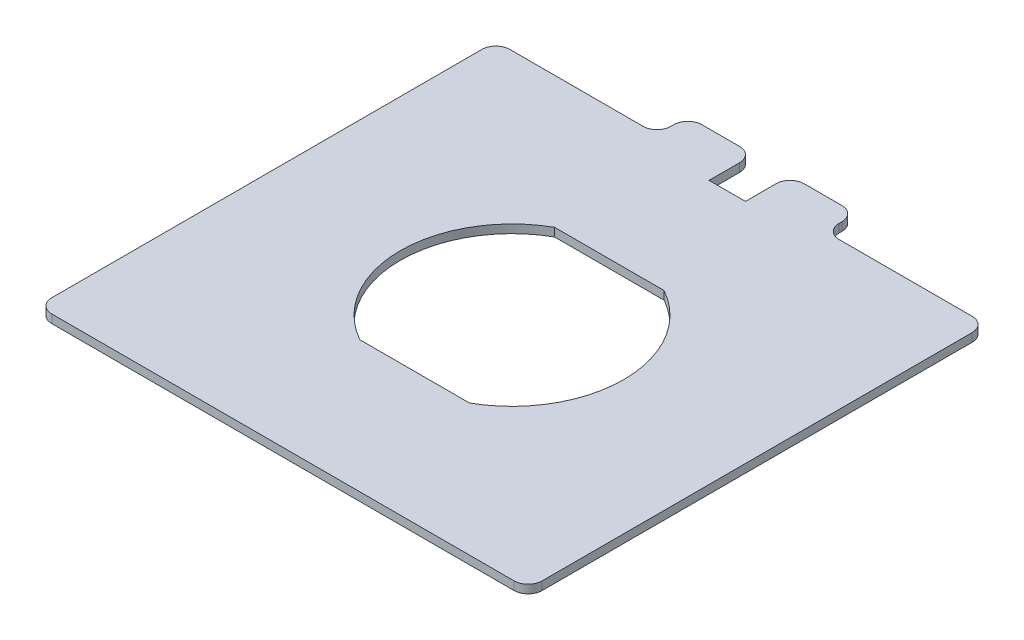
ISO-10303-21;
HEADER;
FILE_DESCRIPTION(('STEP AP214'),'2;1');
FILE_NAME('part.step','',(''),(''),'','','');
FILE_SCHEMA(('AUTOMOTIVE_DESIGN { 1 0 10303 214 1 1 1 1 }'));
ENDSEC;
DATA;
#1=APPLICATION_CONTEXT('core data for automotive mechanical design processes');
#2=APPLICATION_PROTOCOL_DEFINITION('international standard','automotive_design',2000,#1);
#3=PRODUCT_CONTEXT('',#1,'mechanical');
#4=PRODUCT('Part','Part','',(#3));
#5=PRODUCT_RELATED_PRODUCT_CATEGORY('part','',(#4));
#6=PRODUCT_DEFINITION_FORMATION('','',#4);
#7=PRODUCT_DEFINITION_CONTEXT('part definition',#1,'design');
#8=PRODUCT_DEFINITION('design','',#6,#7);
#9=PRODUCT_DEFINITION_SHAPE('','',#8);
#10=(LENGTH_UNIT() NAMED_UNIT(*) SI_UNIT(.MILLI.,.METRE.));
#11=(NAMED_UNIT(*) PLANE_ANGLE_UNIT() SI_UNIT($,.RADIAN.));
#12=(NAMED_UNIT(*) SI_UNIT($,.STERADIAN.) SOLID_ANGLE_UNIT());
#13=UNCERTAINTY_MEASURE_WITH_UNIT(LENGTH_MEASURE(1.E-05),#10,'distance_accuracy_value','');
#14=(GEOMETRIC_REPRESENTATION_CONTEXT(3) GLOBAL_UNCERTAINTY_ASSIGNED_CONTEXT((#13)) GLOBAL_UNIT_ASSIGNED_CONTEXT((#10,
#11,#12)) REPRESENTATION_CONTEXT('',''));
#15=CARTESIAN_POINT('',(0.,0.,0.));
#16=DIRECTION('',(0.,0.,1.));
#17=DIRECTION('',(1.,0.,0.));
#18=AXIS2_PLACEMENT_3D('',#15,#16,#17);
#19=CARTESIAN_POINT('',(-39.5,0.6,13.35));
#20=DIRECTION('',(0.,1.,0.));
#21=DIRECTION('',(0.,0.,1.));
#22=AXIS2_PLACEMENT_3D('',#19,#20,#21);
#23=PLANE('',#22);
#24=CARTESIAN_POINT('',(0.,0.6,0.));
#25=DIRECTION('',(0.,1.,0.));
#26=DIRECTION('',(0.,0.,1.));
#27=AXIS2_PLACEMENT_3D('',#24,#25,#26);
#28=CIRCLE('',#27,7.975);
#29=CARTESIAN_POINT('',(-3.91128175921909,0.6,-6.95));
#30=VERTEX_POINT('',#29);
#31=CARTESIAN_POINT('',(-3.91128175921909,0.6,6.95));
#32=VERTEX_POINT('',#31);
#33=EDGE_CURVE('E54',#30,#32,#28,.T.);
#34=ORIENTED_EDGE('',*,*,#33,.F.);
#35=DIRECTION('',(-1.,0.,0.));
#36=VECTOR('',#35,1.);
#37=CARTESIAN_POINT('',(3.9112817592191,0.6,-6.95));
#38=LINE('',#37,#36);
#39=CARTESIAN_POINT('',(3.9112817592191,0.6,-6.95));
#40=VERTEX_POINT('',#39);
#41=EDGE_CURVE('E229',#40,#30,#38,.T.);
#42=ORIENTED_EDGE('',*,*,#41,.F.);
#43=CARTESIAN_POINT('',(0.,0.6,0.));
#44=DIRECTION('',(0.,1.,0.));
#45=DIRECTION('',(0.,0.,1.));
#46=AXIS2_PLACEMENT_3D('',#43,#44,#45);
#47=CIRCLE('',#46,7.975);
#48=CARTESIAN_POINT('',(3.91128175921909,0.6,6.95));
#49=VERTEX_POINT('',#48);
#50=EDGE_CURVE('E232',#49,#40,#47,.T.);
#51=ORIENTED_EDGE('',*,*,#50,.F.);
#52=DIRECTION('',(1.,0.,0.));
#53=VECTOR('',#52,1.);
#54=CARTESIAN_POINT('',(-3.91128175921909,0.6,6.95));
#55=LINE('',#54,#53);
#56=EDGE_CURVE('E238',#32,#49,#55,.T.);
#57=ORIENTED_EDGE('',*,*,#56,.F.);
#58=EDGE_LOOP('',(#34,#42,#51,#57));
#59=FACE_BOUND('',#58,.T.);
#60=DIRECTION('',(0.,0.,1.));
#61=VECTOR('',#60,1.);
#62=CARTESIAN_POINT('',(-17.5,0.6,-25.5249733421634));
#63=LINE('',#62,#61);
#64=CARTESIAN_POINT('',(-17.5,0.6,-15.35));
#65=VERTEX_POINT('',#64);
#66=CARTESIAN_POINT('',(-17.5,0.6,15.35));
#67=VERTEX_POINT('',#66);
#68=EDGE_CURVE('E252',#65,#67,#63,.T.);
#69=ORIENTED_EDGE('',*,*,#68,.T.);
#70=CARTESIAN_POINT('',(-16.5,0.6,15.35));
#71=DIRECTION('',(0.,1.,0.));
#72=DIRECTION('',(0.,0.,1.));
#73=AXIS2_PLACEMENT_3D('',#70,#71,#72);
#74=CIRCLE('',#73,1.);
#75=CARTESIAN_POINT('',(-16.5,0.6,16.35));
#76=VERTEX_POINT('',#75);
#77=EDGE_CURVE('E381',#67,#76,#74,.T.);
#78=ORIENTED_EDGE('',*,*,#77,.T.);
#79=DIRECTION('',(1.,0.,0.));
#80=VECTOR('',#79,1.);
#81=CARTESIAN_POINT('',(-39.5,0.6,16.35));
#82=LINE('',#81,#80);
#83=CARTESIAN_POINT('',(16.5,0.6,16.35));
#84=VERTEX_POINT('',#83);
#85=EDGE_CURVE('E260',#76,#84,#82,.T.);
#86=ORIENTED_EDGE('',*,*,#85,.T.);
#87=CARTESIAN_POINT('',(16.5,0.6,15.35));
#88=DIRECTION('',(0.,1.,0.));
#89=DIRECTION('',(0.,0.,1.));
#90=AXIS2_PLACEMENT_3D('',#87,#88,#89);
#91=CIRCLE('',#90,1.);
#92=CARTESIAN_POINT('',(17.5,0.6,15.35));
#93=VERTEX_POINT('',#92);
#94=EDGE_CURVE('E379',#84,#93,#91,.T.);
#95=ORIENTED_EDGE('',*,*,#94,.T.);
#96=DIRECTION('',(0.,0.,-1.));
#97=VECTOR('',#96,1.);
#98=CARTESIAN_POINT('',(17.5,0.6,-25.5249733421634));
#99=LINE('',#98,#97);
#100=CARTESIAN_POINT('',(17.5,0.6,-15.35));
#101=VERTEX_POINT('',#100);
#102=EDGE_CURVE('E244',#93,#101,#99,.T.);
#103=ORIENTED_EDGE('',*,*,#102,.T.);
#104=CARTESIAN_POINT('',(16.5,0.6,-15.35));
#105=DIRECTION('',(0.,1.,0.));
#106=DIRECTION('',(0.,0.,1.));
#107=AXIS2_PLACEMENT_3D('',#104,#105,#106);
#108=CIRCLE('',#107,1.);
#109=CARTESIAN_POINT('',(16.5,0.6,-16.35));
#110=VERTEX_POINT('',#109);
#111=EDGE_CURVE('E377',#101,#110,#108,.T.);
#112=ORIENTED_EDGE('',*,*,#111,.T.);
#113=DIRECTION('',(-1.,0.,0.));
#114=VECTOR('',#113,1.);
#115=CARTESIAN_POINT('',(7.,0.6,-16.35));
#116=LINE('',#115,#114);
#117=CARTESIAN_POINT('',(6.99999999999999,0.6,-16.35));
#118=VERTEX_POINT('',#117);
#119=EDGE_CURVE('E263',#110,#118,#116,.T.);
#120=ORIENTED_EDGE('',*,*,#119,.T.);
#121=CARTESIAN_POINT('',(6.99999999999999,0.6,-17.35));
#122=DIRECTION('',(0.,-1.,0.));
#123=DIRECTION('',(0.,0.,1.));
#124=AXIS2_PLACEMENT_3D('',#121,#122,#123);
#125=CIRCLE('',#124,1.);
#126=CARTESIAN_POINT('',(5.99999999999999,0.6,-17.35));
#127=VERTEX_POINT('',#126);
#128=EDGE_CURVE('E266',#118,#127,#125,.T.);
#129=ORIENTED_EDGE('',*,*,#128,.T.);
#130=DIRECTION('',(0.,0.,-1.));
#131=VECTOR('',#130,1.);
#132=CARTESIAN_POINT('',(5.99999999999999,0.6,-17.55));
#133=LINE('',#132,#131);
#134=CARTESIAN_POINT('',(5.99999999999999,0.6,-17.55));
#135=VERTEX_POINT('',#134);
#136=EDGE_CURVE('E268',#127,#135,#133,.T.);
#137=ORIENTED_EDGE('',*,*,#136,.T.);
#138=CARTESIAN_POINT('',(4.99999999999999,0.6,-17.55));
#139=DIRECTION('',(0.,1.,0.));
#140=DIRECTION('',(0.,0.,-1.));
#141=AXIS2_PLACEMENT_3D('',#138,#139,#140);
#142=CIRCLE('',#141,1.);
#143=CARTESIAN_POINT('',(4.99999999999999,0.6,-18.55));
#144=VERTEX_POINT('',#143);
#145=EDGE_CURVE('E270',#135,#144,#142,.T.);
#146=ORIENTED_EDGE('',*,*,#145,.T.);
#147=DIRECTION('',(-1.,0.,0.));
#148=VECTOR('',#147,1.);
#149=CARTESIAN_POINT('',(2.30000000000001,0.6,-18.55));
#150=LINE('',#149,#148);
#151=CARTESIAN_POINT('',(2.3,0.6,-18.55));
#152=VERTEX_POINT('',#151);
#153=EDGE_CURVE('E272',#144,#152,#150,.T.);
#154=ORIENTED_EDGE('',*,*,#153,.T.);
#155=CARTESIAN_POINT('',(2.3,0.6,-17.55));
#156=DIRECTION('',(0.,1.,0.));
#157=DIRECTION('',(0.,0.,-1.));
#158=AXIS2_PLACEMENT_3D('',#155,#156,#157);
#159=CIRCLE('',#158,1.);
#160=CARTESIAN_POINT('',(1.3,0.6,-17.55));
#161=VERTEX_POINT('',#160);
#162=EDGE_CURVE('E274',#152,#161,#159,.T.);
#163=ORIENTED_EDGE('',*,*,#162,.T.);
#164=DIRECTION('',(0.,0.,1.));
#165=VECTOR('',#164,1.);
#166=CARTESIAN_POINT('',(1.3,0.6,-17.55));
#167=LINE('',#166,#165);
#168=CARTESIAN_POINT('',(1.3,0.6,-15.362970146831));
#169=VERTEX_POINT('',#168);
#170=EDGE_CURVE('E276',#161,#169,#167,.T.);
#171=ORIENTED_EDGE('',*,*,#170,.T.);
#172=DIRECTION('',(-1.,0.,0.));
#173=VECTOR('',#172,1.);
#174=CARTESIAN_POINT('',(-1.3,0.6,-15.362970146831));
#175=LINE('',#174,#173);
#176=CARTESIAN_POINT('',(-1.3,0.6,-15.362970146831));
#177=VERTEX_POINT('',#176);
#178=EDGE_CURVE('E278',#169,#177,#175,.T.);
#179=ORIENTED_EDGE('',*,*,#178,.T.);
#180=DIRECTION('',(0.,0.,-1.));
#181=VECTOR('',#180,1.);
#182=CARTESIAN_POINT('',(-1.3,0.6,-17.55));
#183=LINE('',#182,#181);
#184=CARTESIAN_POINT('',(-1.3,0.6,-17.55));
#185=VERTEX_POINT('',#184);
#186=EDGE_CURVE('E280',#177,#185,#183,.T.);
#187=ORIENTED_EDGE('',*,*,#186,.T.);
#188=CARTESIAN_POINT('',(-2.3,0.6,-17.55));
#189=DIRECTION('',(0.,1.,0.));
#190=DIRECTION('',(0.,0.,1.));
#191=AXIS2_PLACEMENT_3D('',#188,#189,#190);
#192=CIRCLE('',#191,1.);
#193=CARTESIAN_POINT('',(-2.3,0.6,-18.55));
#194=VERTEX_POINT('',#193);
#195=EDGE_CURVE('E282',#185,#194,#192,.T.);
#196=ORIENTED_EDGE('',*,*,#195,.T.);
#197=DIRECTION('',(-1.,0.,0.));
#198=VECTOR('',#197,1.);
#199=CARTESIAN_POINT('',(-5.,0.6,-18.55));
#200=LINE('',#199,#198);
#201=CARTESIAN_POINT('',(-5.,0.6,-18.55));
#202=VERTEX_POINT('',#201);
#203=EDGE_CURVE('E284',#194,#202,#200,.T.);
#204=ORIENTED_EDGE('',*,*,#203,.T.);
#205=CARTESIAN_POINT('',(-5.00000000000001,0.6,-17.55));
#206=DIRECTION('',(0.,1.,0.));
#207=DIRECTION('',(0.,0.,1.));
#208=AXIS2_PLACEMENT_3D('',#205,#206,#207);
#209=CIRCLE('',#208,1.);
#210=CARTESIAN_POINT('',(-6.00000000000001,0.6,-17.55));
#211=VERTEX_POINT('',#210);
#212=EDGE_CURVE('E286',#202,#211,#209,.T.);
#213=ORIENTED_EDGE('',*,*,#212,.T.);
#214=DIRECTION('',(0.,0.,1.));
#215=VECTOR('',#214,1.);
#216=CARTESIAN_POINT('',(-6.00000000000001,0.6,-17.55));
#217=LINE('',#216,#215);
#218=CARTESIAN_POINT('',(-6.00000000000001,0.6,-17.35));
#219=VERTEX_POINT('',#218);
#220=EDGE_CURVE('E288',#211,#219,#217,.T.);
#221=ORIENTED_EDGE('',*,*,#220,.T.);
#222=CARTESIAN_POINT('',(-7.00000000000001,0.6,-17.35));
#223=DIRECTION('',(0.,-1.,0.));
#224=DIRECTION('',(0.,0.,-1.));
#225=AXIS2_PLACEMENT_3D('',#222,#223,#224);
#226=CIRCLE('',#225,1.);
#227=CARTESIAN_POINT('',(-7.00000000000001,0.6,-16.35));
#228=VERTEX_POINT('',#227);
#229=EDGE_CURVE('E290',#219,#228,#226,.T.);
#230=ORIENTED_EDGE('',*,*,#229,.T.);
#231=DIRECTION('',(-1.,0.,0.));
#232=VECTOR('',#231,1.);
#233=CARTESIAN_POINT('',(-39.5,0.6,-16.35));
#234=LINE('',#233,#232);
#235=CARTESIAN_POINT('',(-16.5,0.6,-16.35));
#236=VERTEX_POINT('',#235);
#237=EDGE_CURVE('E292',#228,#236,#234,.T.);
#238=ORIENTED_EDGE('',*,*,#237,.T.);
#239=CARTESIAN_POINT('',(-16.5,0.6,-15.35));
#240=DIRECTION('',(0.,1.,0.));
#241=DIRECTION('',(0.,0.,1.));
#242=AXIS2_PLACEMENT_3D('',#239,#240,#241);
#243=CIRCLE('',#242,1.);
#244=EDGE_CURVE('E375',#236,#65,#243,.T.);
#245=ORIENTED_EDGE('',*,*,#244,.T.);
#246=EDGE_LOOP('',(#69,#78,#86,#95,#103,#112,#120,#129,#137,#146,#154,#163,#171,#179,#187,#196,
#204,#213,#221,#230,#238,#245));
#247=FACE_BOUND('',#246,.T.);
#248=ADVANCED_FACE('F39',(#59,#247),#23,.T.);
#249=CARTESIAN_POINT('',(-39.5,0.,13.35));
#250=DIRECTION('',(0.,1.,0.));
#251=DIRECTION('',(0.,0.,1.));
#252=AXIS2_PLACEMENT_3D('',#249,#250,#251);
#253=PLANE('',#252);
#254=DIRECTION('',(-1.,0.,0.));
#255=VECTOR('',#254,1.);
#256=CARTESIAN_POINT('',(3.9112817592191,0.,-6.95));
#257=LINE('',#256,#255);
#258=CARTESIAN_POINT('',(3.9112817592191,0.,-6.95));
#259=VERTEX_POINT('',#258);
#260=CARTESIAN_POINT('',(-3.91128175921909,0.,-6.95));
#261=VERTEX_POINT('',#260);
#262=EDGE_CURVE('E219',#259,#261,#257,.T.);
#263=ORIENTED_EDGE('',*,*,#262,.T.);
#264=CARTESIAN_POINT('',(0.,0.,0.));
#265=DIRECTION('',(0.,1.,0.));
#266=DIRECTION('',(0.,0.,1.));
#267=AXIS2_PLACEMENT_3D('',#264,#265,#266);
#268=CIRCLE('',#267,7.975);
#269=CARTESIAN_POINT('',(-3.91128175921909,0.,6.95));
#270=VERTEX_POINT('',#269);
#271=EDGE_CURVE('E213',#261,#270,#268,.T.);
#272=ORIENTED_EDGE('',*,*,#271,.T.);
#273=DIRECTION('',(1.,0.,0.));
#274=VECTOR('',#273,1.);
#275=CARTESIAN_POINT('',(-3.91128175921909,0.,6.95));
#276=LINE('',#275,#274);
#277=CARTESIAN_POINT('',(3.91128175921909,0.,6.95));
#278=VERTEX_POINT('',#277);
#279=EDGE_CURVE('E222',#270,#278,#276,.T.);
#280=ORIENTED_EDGE('',*,*,#279,.T.);
#281=CARTESIAN_POINT('',(0.,0.,0.));
#282=DIRECTION('',(0.,1.,0.));
#283=DIRECTION('',(0.,0.,1.));
#284=AXIS2_PLACEMENT_3D('',#281,#282,#283);
#285=CIRCLE('',#284,7.975);
#286=EDGE_CURVE('E62',#278,#259,#285,.T.);
#287=ORIENTED_EDGE('',*,*,#286,.T.);
#288=EDGE_LOOP('',(#263,#272,#280,#287));
#289=FACE_BOUND('',#288,.T.);
#290=DIRECTION('',(1.,0.,0.));
#291=VECTOR('',#290,1.);
#292=CARTESIAN_POINT('',(-39.5,0.,16.35));
#293=LINE('',#292,#291);
#294=CARTESIAN_POINT('',(-16.5,0.,16.35));
#295=VERTEX_POINT('',#294);
#296=CARTESIAN_POINT('',(16.5,0.,16.35));
#297=VERTEX_POINT('',#296);
#298=EDGE_CURVE('E255',#295,#297,#293,.T.);
#299=ORIENTED_EDGE('',*,*,#298,.F.);
#300=CARTESIAN_POINT('',(-16.5,0.,15.35));
#301=DIRECTION('',(0.,1.,0.));
#302=DIRECTION('',(0.,0.,1.));
#303=AXIS2_PLACEMENT_3D('',#300,#301,#302);
#304=CIRCLE('',#303,1.);
#305=CARTESIAN_POINT('',(-17.5,0.,15.35));
#306=VERTEX_POINT('',#305);
#307=EDGE_CURVE('E393',#295,#306,#304,.F.);
#308=ORIENTED_EDGE('',*,*,#307,.T.);
#309=DIRECTION('',(0.,0.,1.));
#310=VECTOR('',#309,1.);
#311=CARTESIAN_POINT('',(-17.5,0.,-25.5249733421634));
#312=LINE('',#311,#310);
#313=CARTESIAN_POINT('',(-17.5,0.,-15.35));
#314=VERTEX_POINT('',#313);
#315=EDGE_CURVE('E251',#314,#306,#312,.T.);
#316=ORIENTED_EDGE('',*,*,#315,.F.);
#317=CARTESIAN_POINT('',(-16.5,0.,-15.35));
#318=DIRECTION('',(0.,1.,0.));
#319=DIRECTION('',(0.,0.,1.));
#320=AXIS2_PLACEMENT_3D('',#317,#318,#319);
#321=CIRCLE('',#320,1.);
#322=CARTESIAN_POINT('',(-16.5,0.,-16.35));
#323=VERTEX_POINT('',#322);
#324=EDGE_CURVE('E387',#314,#323,#321,.F.);
#325=ORIENTED_EDGE('',*,*,#324,.T.);
#326=DIRECTION('',(-1.,0.,0.));
#327=VECTOR('',#326,1.);
#328=CARTESIAN_POINT('',(-39.5,0.,-16.35));
#329=LINE('',#328,#327);
#330=CARTESIAN_POINT('',(-7.00000000000001,0.,-16.35));
#331=VERTEX_POINT('',#330);
#332=EDGE_CURVE('E264',#331,#323,#329,.T.);
#333=ORIENTED_EDGE('',*,*,#332,.F.);
#334=CARTESIAN_POINT('',(-7.00000000000001,0.,-17.35));
#335=DIRECTION('',(0.,-1.,0.));
#336=DIRECTION('',(0.,0.,-1.));
#337=AXIS2_PLACEMENT_3D('',#334,#335,#336);
#338=CIRCLE('',#337,1.);
#339=CARTESIAN_POINT('',(-6.00000000000001,0.,-17.35));
#340=VERTEX_POINT('',#339);
#341=EDGE_CURVE('E324',#340,#331,#338,.T.);
#342=ORIENTED_EDGE('',*,*,#341,.F.);
#343=DIRECTION('',(0.,0.,1.));
#344=VECTOR('',#343,1.);
#345=CARTESIAN_POINT('',(-6.00000000000001,0.,-17.55));
#346=LINE('',#345,#344);
#347=CARTESIAN_POINT('',(-6.00000000000001,0.,-17.55));
#348=VERTEX_POINT('',#347);
#349=EDGE_CURVE('E322',#348,#340,#346,.T.);
#350=ORIENTED_EDGE('',*,*,#349,.F.);
#351=CARTESIAN_POINT('',(-5.00000000000001,0.,-17.55));
#352=DIRECTION('',(0.,1.,0.));
#353=DIRECTION('',(0.,0.,1.));
#354=AXIS2_PLACEMENT_3D('',#351,#352,#353);
#355=CIRCLE('',#354,1.);
#356=CARTESIAN_POINT('',(-5.,0.,-18.55));
#357=VERTEX_POINT('',#356);
#358=EDGE_CURVE('E320',#357,#348,#355,.T.);
#359=ORIENTED_EDGE('',*,*,#358,.F.);
#360=DIRECTION('',(-1.,0.,0.));
#361=VECTOR('',#360,1.);
#362=CARTESIAN_POINT('',(-5.,0.,-18.55));
#363=LINE('',#362,#361);
#364=CARTESIAN_POINT('',(-2.3,0.,-18.55));
#365=VERTEX_POINT('',#364);
#366=EDGE_CURVE('E318',#365,#357,#363,.T.);
#367=ORIENTED_EDGE('',*,*,#366,.F.);
#368=CARTESIAN_POINT('',(-2.3,0.,-17.55));
#369=DIRECTION('',(0.,1.,0.));
#370=DIRECTION('',(0.,0.,1.));
#371=AXIS2_PLACEMENT_3D('',#368,#369,#370);
#372=CIRCLE('',#371,1.);
#373=CARTESIAN_POINT('',(-1.3,0.,-17.55));
#374=VERTEX_POINT('',#373);
#375=EDGE_CURVE('E316',#374,#365,#372,.T.);
#376=ORIENTED_EDGE('',*,*,#375,.F.);
#377=DIRECTION('',(0.,0.,-1.));
#378=VECTOR('',#377,1.);
#379=CARTESIAN_POINT('',(-1.3,0.,-17.55));
#380=LINE('',#379,#378);
#381=CARTESIAN_POINT('',(-1.3,0.,-15.362970146831));
#382=VERTEX_POINT('',#381);
#383=EDGE_CURVE('E314',#382,#374,#380,.T.);
#384=ORIENTED_EDGE('',*,*,#383,.F.);
#385=DIRECTION('',(-1.,0.,0.));
#386=VECTOR('',#385,1.);
#387=CARTESIAN_POINT('',(-1.3,0.,-15.362970146831));
#388=LINE('',#387,#386);
#389=CARTESIAN_POINT('',(1.3,0.,-15.362970146831));
#390=VERTEX_POINT('',#389);
#391=EDGE_CURVE('E312',#390,#382,#388,.T.);
#392=ORIENTED_EDGE('',*,*,#391,.F.);
#393=DIRECTION('',(0.,0.,1.));
#394=VECTOR('',#393,1.);
#395=CARTESIAN_POINT('',(1.3,0.,-17.55));
#396=LINE('',#395,#394);
#397=CARTESIAN_POINT('',(1.3,0.,-17.55));
#398=VERTEX_POINT('',#397);
#399=EDGE_CURVE('E310',#398,#390,#396,.T.);
#400=ORIENTED_EDGE('',*,*,#399,.F.);
#401=CARTESIAN_POINT('',(2.3,0.,-17.55));
#402=DIRECTION('',(0.,1.,0.));
#403=DIRECTION('',(0.,0.,-1.));
#404=AXIS2_PLACEMENT_3D('',#401,#402,#403);
#405=CIRCLE('',#404,1.);
#406=CARTESIAN_POINT('',(2.3,0.,-18.55));
#407=VERTEX_POINT('',#406);
#408=EDGE_CURVE('E308',#407,#398,#405,.T.);
#409=ORIENTED_EDGE('',*,*,#408,.F.);
#410=DIRECTION('',(-1.,0.,0.));
#411=VECTOR('',#410,1.);
#412=CARTESIAN_POINT('',(2.30000000000001,0.,-18.55));
#413=LINE('',#412,#411);
#414=CARTESIAN_POINT('',(4.99999999999999,0.,-18.55));
#415=VERTEX_POINT('',#414);
#416=EDGE_CURVE('E306',#415,#407,#413,.T.);
#417=ORIENTED_EDGE('',*,*,#416,.F.);
#418=CARTESIAN_POINT('',(4.99999999999999,0.,-17.55));
#419=DIRECTION('',(0.,1.,0.));
#420=DIRECTION('',(0.,0.,-1.));
#421=AXIS2_PLACEMENT_3D('',#418,#419,#420);
#422=CIRCLE('',#421,1.);
#423=CARTESIAN_POINT('',(5.99999999999999,0.,-17.55));
#424=VERTEX_POINT('',#423);
#425=EDGE_CURVE('E304',#424,#415,#422,.T.);
#426=ORIENTED_EDGE('',*,*,#425,.F.);
#427=DIRECTION('',(0.,0.,-1.));
#428=VECTOR('',#427,1.);
#429=CARTESIAN_POINT('',(5.99999999999999,0.,-17.55));
#430=LINE('',#429,#428);
#431=CARTESIAN_POINT('',(5.99999999999999,0.,-17.35));
#432=VERTEX_POINT('',#431);
#433=EDGE_CURVE('E302',#432,#424,#430,.T.);
#434=ORIENTED_EDGE('',*,*,#433,.F.);
#435=CARTESIAN_POINT('',(6.99999999999999,0.,-17.35));
#436=DIRECTION('',(0.,-1.,0.));
#437=DIRECTION('',(0.,0.,1.));
#438=AXIS2_PLACEMENT_3D('',#435,#436,#437);
#439=CIRCLE('',#438,1.);
#440=CARTESIAN_POINT('',(6.99999999999999,0.,-16.35));
#441=VERTEX_POINT('',#440);
#442=EDGE_CURVE('E300',#441,#432,#439,.T.);
#443=ORIENTED_EDGE('',*,*,#442,.F.);
#444=DIRECTION('',(-1.,0.,0.));
#445=VECTOR('',#444,1.);
#446=CARTESIAN_POINT('',(7.,0.,-16.35));
#447=LINE('',#446,#445);
#448=CARTESIAN_POINT('',(16.5,0.,-16.35));
#449=VERTEX_POINT('',#448);
#450=EDGE_CURVE('E298',#449,#441,#447,.T.);
#451=ORIENTED_EDGE('',*,*,#450,.F.);
#452=CARTESIAN_POINT('',(16.5,0.,-15.35));
#453=DIRECTION('',(0.,1.,0.));
#454=DIRECTION('',(0.,0.,1.));
#455=AXIS2_PLACEMENT_3D('',#452,#453,#454);
#456=CIRCLE('',#455,1.);
#457=CARTESIAN_POINT('',(17.5,0.,-15.35));
#458=VERTEX_POINT('',#457);
#459=EDGE_CURVE('E389',#449,#458,#456,.F.);
#460=ORIENTED_EDGE('',*,*,#459,.T.);
#461=DIRECTION('',(0.,0.,-1.));
#462=VECTOR('',#461,1.);
#463=CARTESIAN_POINT('',(17.5,0.,-25.5249733421634));
#464=LINE('',#463,#462);
#465=CARTESIAN_POINT('',(17.5,0.,15.35));
#466=VERTEX_POINT('',#465);
#467=EDGE_CURVE('E248',#466,#458,#464,.T.);
#468=ORIENTED_EDGE('',*,*,#467,.F.);
#469=CARTESIAN_POINT('',(16.5,0.,15.35));
#470=DIRECTION('',(0.,1.,0.));
#471=DIRECTION('',(0.,0.,1.));
#472=AXIS2_PLACEMENT_3D('',#469,#470,#471);
#473=CIRCLE('',#472,1.);
#474=EDGE_CURVE('E391',#466,#297,#473,.F.);
#475=ORIENTED_EDGE('',*,*,#474,.T.);
#476=EDGE_LOOP('',(#299,#308,#316,#325,#333,#342,#350,#359,#367,#376,#384,#392,#400,#409,#417,
#426,#434,#443,#451,#460,#468,#475));
#477=FACE_BOUND('',#476,.T.);
#478=ADVANCED_FACE('F226',(#289,#477),#253,.F.);
#479=CARTESIAN_POINT('',(-39.5,0.6,16.35));
#480=DIRECTION('',(0.,0.,-1.));
#481=DIRECTION('',(-1.,0.,0.));
#482=AXIS2_PLACEMENT_3D('',#479,#480,#481);
#483=PLANE('',#482);
#484=ORIENTED_EDGE('',*,*,#85,.F.);
#485=DIRECTION('',(0.,1.,0.));
#486=VECTOR('',#485,1.);
#487=CARTESIAN_POINT('',(-16.5,0.,16.35));
#488=LINE('',#487,#486);
#489=EDGE_CURVE('E385',#76,#295,#488,.F.);
#490=ORIENTED_EDGE('',*,*,#489,.T.);
#491=ORIENTED_EDGE('',*,*,#298,.T.);
#492=DIRECTION('',(0.,-1.,0.));
#493=VECTOR('',#492,1.);
#494=CARTESIAN_POINT('',(16.5,0.6,16.35));
#495=LINE('',#494,#493);
#496=EDGE_CURVE('E383',#297,#84,#495,.F.);
#497=ORIENTED_EDGE('',*,*,#496,.T.);
#498=EDGE_LOOP('',(#484,#490,#491,#497));
#499=FACE_BOUND('',#498,.T.);
#500=ADVANCED_FACE('F426',(#499),#483,.F.);
#501=CARTESIAN_POINT('',(7.,0.6,-16.35));
#502=DIRECTION('',(0.,0.,1.));
#503=DIRECTION('',(1.,0.,0.));
#504=AXIS2_PLACEMENT_3D('',#501,#502,#503);
#505=PLANE('',#504);
#506=ORIENTED_EDGE('',*,*,#119,.F.);
#507=DIRECTION('',(0.,1.,0.));
#508=VECTOR('',#507,1.);
#509=CARTESIAN_POINT('',(16.5,0.,-16.35));
#510=LINE('',#509,#508);
#511=EDGE_CURVE('E47',#110,#449,#510,.F.);
#512=ORIENTED_EDGE('',*,*,#511,.T.);
#513=ORIENTED_EDGE('',*,*,#450,.T.);
#514=DIRECTION('',(0.,-1.,0.));
#515=VECTOR('',#514,1.);
#516=CARTESIAN_POINT('',(6.99999999999999,0.6,-16.35));
#517=LINE('',#516,#515);
#518=EDGE_CURVE('E366',#118,#441,#517,.T.);
#519=ORIENTED_EDGE('',*,*,#518,.F.);
#520=EDGE_LOOP('',(#506,#512,#513,#519));
#521=FACE_BOUND('',#520,.T.);
#522=ADVANCED_FACE('F404',(#521),#505,.F.);
#523=CARTESIAN_POINT('',(-39.5,0.6,-16.35));
#524=DIRECTION('',(0.,0.,1.));
#525=DIRECTION('',(1.,0.,0.));
#526=AXIS2_PLACEMENT_3D('',#523,#524,#525);
#527=PLANE('',#526);
#528=ORIENTED_EDGE('',*,*,#332,.T.);
#529=DIRECTION('',(0.,-1.,0.));
#530=VECTOR('',#529,1.);
#531=CARTESIAN_POINT('',(-16.5,0.6,-16.35));
#532=LINE('',#531,#530);
#533=EDGE_CURVE('E11',#323,#236,#532,.F.);
#534=ORIENTED_EDGE('',*,*,#533,.T.);
#535=ORIENTED_EDGE('',*,*,#237,.F.);
#536=DIRECTION('',(0.,-1.,0.));
#537=VECTOR('',#536,1.);
#538=CARTESIAN_POINT('',(-7.00000000000001,0.6,-16.35));
#539=LINE('',#538,#537);
#540=EDGE_CURVE('E295',#228,#331,#539,.T.);
#541=ORIENTED_EDGE('',*,*,#540,.T.);
#542=EDGE_LOOP('',(#528,#534,#535,#541));
#543=FACE_BOUND('',#542,.T.);
#544=ADVANCED_FACE('F442',(#543),#527,.F.);
#545=CARTESIAN_POINT('',(6.99999999999999,0.6,-17.35));
#546=DIRECTION('',(0.,-1.,0.));
#547=DIRECTION('',(0.,0.,-1.));
#548=AXIS2_PLACEMENT_3D('',#545,#546,#547);
#549=CYLINDRICAL_SURFACE('',#548,1.);
#550=ORIENTED_EDGE('',*,*,#442,.T.);
#551=DIRECTION('',(0.,-1.,0.));
#552=VECTOR('',#551,1.);
#553=CARTESIAN_POINT('',(5.99999999999999,0.6,-17.35));
#554=LINE('',#553,#552);
#555=EDGE_CURVE('E363',#127,#432,#554,.T.);
#556=ORIENTED_EDGE('',*,*,#555,.F.);
#557=ORIENTED_EDGE('',*,*,#128,.F.);
#558=ORIENTED_EDGE('',*,*,#518,.T.);
#559=EDGE_LOOP('',(#550,#556,#557,#558));
#560=FACE_BOUND('',#559,.T.);
#561=ADVANCED_FACE('F505',(#560),#549,.F.);
#562=CARTESIAN_POINT('',(5.99999999999999,0.6,-17.55));
#563=DIRECTION('',(-1.,0.,0.));
#564=DIRECTION('',(0.,0.,1.));
#565=AXIS2_PLACEMENT_3D('',#562,#563,#564);
#566=PLANE('',#565);
#567=ORIENTED_EDGE('',*,*,#433,.T.);
#568=DIRECTION('',(0.,-1.,0.));
#569=VECTOR('',#568,1.);
#570=CARTESIAN_POINT('',(5.99999999999999,0.6,-17.55));
#571=LINE('',#570,#569);
#572=EDGE_CURVE('E360',#135,#424,#571,.T.);
#573=ORIENTED_EDGE('',*,*,#572,.F.);
#574=ORIENTED_EDGE('',*,*,#136,.F.);
#575=ORIENTED_EDGE('',*,*,#555,.T.);
#576=EDGE_LOOP('',(#567,#573,#574,#575));
#577=FACE_BOUND('',#576,.T.);
#578=ADVANCED_FACE('F501',(#577),#566,.F.);
#579=CARTESIAN_POINT('',(4.99999999999999,0.6,-17.55));
#580=DIRECTION('',(0.,-1.,0.));
#581=DIRECTION('',(0.,0.,-1.));
#582=AXIS2_PLACEMENT_3D('',#579,#580,#581);
#583=CYLINDRICAL_SURFACE('',#582,1.);
#584=ORIENTED_EDGE('',*,*,#425,.T.);
#585=DIRECTION('',(0.,-1.,0.));
#586=VECTOR('',#585,1.);
#587=CARTESIAN_POINT('',(4.99999999999999,0.6,-18.55));
#588=LINE('',#587,#586);
#589=EDGE_CURVE('E357',#144,#415,#588,.T.);
#590=ORIENTED_EDGE('',*,*,#589,.F.);
#591=ORIENTED_EDGE('',*,*,#145,.F.);
#592=ORIENTED_EDGE('',*,*,#572,.T.);
#593=EDGE_LOOP('',(#584,#590,#591,#592));
#594=FACE_BOUND('',#593,.T.);
#595=ADVANCED_FACE('F496',(#594),#583,.T.);
#596=CARTESIAN_POINT('',(2.30000000000001,0.6,-18.55));
#597=DIRECTION('',(0.,0.,1.));
#598=DIRECTION('',(1.,0.,0.));
#599=AXIS2_PLACEMENT_3D('',#596,#597,#598);
#600=PLANE('',#599);
#601=ORIENTED_EDGE('',*,*,#416,.T.);
#602=DIRECTION('',(0.,-1.,0.));
#603=VECTOR('',#602,1.);
#604=CARTESIAN_POINT('',(2.3,0.6,-18.55));
#605=LINE('',#604,#603);
#606=EDGE_CURVE('E354',#152,#407,#605,.T.);
#607=ORIENTED_EDGE('',*,*,#606,.F.);
#608=ORIENTED_EDGE('',*,*,#153,.F.);
#609=ORIENTED_EDGE('',*,*,#589,.T.);
#610=EDGE_LOOP('',(#601,#607,#608,#609));
#611=FACE_BOUND('',#610,.T.);
#612=ADVANCED_FACE('F492',(#611),#600,.F.);
#613=CARTESIAN_POINT('',(2.3,0.6,-17.55));
#614=DIRECTION('',(0.,-1.,0.));
#615=DIRECTION('',(0.,0.,-1.));
#616=AXIS2_PLACEMENT_3D('',#613,#614,#615);
#617=CYLINDRICAL_SURFACE('',#616,1.);
#618=ORIENTED_EDGE('',*,*,#408,.T.);
#619=DIRECTION('',(0.,-1.,0.));
#620=VECTOR('',#619,1.);
#621=CARTESIAN_POINT('',(1.3,0.6,-17.55));
#622=LINE('',#621,#620);
#623=EDGE_CURVE('E351',#161,#398,#622,.T.);
#624=ORIENTED_EDGE('',*,*,#623,.F.);
#625=ORIENTED_EDGE('',*,*,#162,.F.);
#626=ORIENTED_EDGE('',*,*,#606,.T.);
#627=EDGE_LOOP('',(#618,#624,#625,#626));
#628=FACE_BOUND('',#627,.T.);
#629=ADVANCED_FACE('F488',(#628),#617,.T.);
#630=CARTESIAN_POINT('',(1.3,0.6,-17.55));
#631=DIRECTION('',(1.,0.,0.));
#632=DIRECTION('',(0.,0.,-1.));
#633=AXIS2_PLACEMENT_3D('',#630,#631,#632);
#634=PLANE('',#633);
#635=ORIENTED_EDGE('',*,*,#399,.T.);
#636=DIRECTION('',(0.,-1.,0.));
#637=VECTOR('',#636,1.);
#638=CARTESIAN_POINT('',(1.3,0.6,-15.362970146831));
#639=LINE('',#638,#637);
#640=EDGE_CURVE('E348',#169,#390,#639,.T.);
#641=ORIENTED_EDGE('',*,*,#640,.F.);
#642=ORIENTED_EDGE('',*,*,#170,.F.);
#643=ORIENTED_EDGE('',*,*,#623,.T.);
#644=EDGE_LOOP('',(#635,#641,#642,#643));
#645=FACE_BOUND('',#644,.T.);
#646=ADVANCED_FACE('F483',(#645),#634,.F.);
#647=CARTESIAN_POINT('',(-1.3,0.6,-15.362970146831));
#648=DIRECTION('',(0.,0.,1.));
#649=DIRECTION('',(1.,0.,0.));
#650=AXIS2_PLACEMENT_3D('',#647,#648,#649);
#651=PLANE('',#650);
#652=ORIENTED_EDGE('',*,*,#391,.T.);
#653=DIRECTION('',(0.,-1.,0.));
#654=VECTOR('',#653,1.);
#655=CARTESIAN_POINT('',(-1.3,0.6,-15.362970146831));
#656=LINE('',#655,#654);
#657=EDGE_CURVE('E345',#177,#382,#656,.T.);
#658=ORIENTED_EDGE('',*,*,#657,.F.);
#659=ORIENTED_EDGE('',*,*,#178,.F.);
#660=ORIENTED_EDGE('',*,*,#640,.T.);
#661=EDGE_LOOP('',(#652,#658,#659,#660));
#662=FACE_BOUND('',#661,.T.);
#663=ADVANCED_FACE('F477',(#662),#651,.F.);
#664=CARTESIAN_POINT('',(-1.3,0.6,-17.55));
#665=DIRECTION('',(-1.,0.,0.));
#666=DIRECTION('',(0.,0.,1.));
#667=AXIS2_PLACEMENT_3D('',#664,#665,#666);
#668=PLANE('',#667);
#669=ORIENTED_EDGE('',*,*,#383,.T.);
#670=DIRECTION('',(0.,-1.,0.));
#671=VECTOR('',#670,1.);
#672=CARTESIAN_POINT('',(-1.3,0.6,-17.55));
#673=LINE('',#672,#671);
#674=EDGE_CURVE('E342',#185,#374,#673,.T.);
#675=ORIENTED_EDGE('',*,*,#674,.F.);
#676=ORIENTED_EDGE('',*,*,#186,.F.);
#677=ORIENTED_EDGE('',*,*,#657,.T.);
#678=EDGE_LOOP('',(#669,#675,#676,#677));
#679=FACE_BOUND('',#678,.T.);
#680=ADVANCED_FACE('F473',(#679),#668,.F.);
#681=CARTESIAN_POINT('',(-2.3,0.6,-17.55));
#682=DIRECTION('',(0.,-1.,0.));
#683=DIRECTION('',(0.,0.,-1.));
#684=AXIS2_PLACEMENT_3D('',#681,#682,#683);
#685=CYLINDRICAL_SURFACE('',#684,1.);
#686=ORIENTED_EDGE('',*,*,#375,.T.);
#687=DIRECTION('',(0.,-1.,0.));
#688=VECTOR('',#687,1.);
#689=CARTESIAN_POINT('',(-2.3,0.6,-18.55));
#690=LINE('',#689,#688);
#691=EDGE_CURVE('E339',#194,#365,#690,.T.);
#692=ORIENTED_EDGE('',*,*,#691,.F.);
#693=ORIENTED_EDGE('',*,*,#195,.F.);
#694=ORIENTED_EDGE('',*,*,#674,.T.);
#695=EDGE_LOOP('',(#686,#692,#693,#694));
#696=FACE_BOUND('',#695,.T.);
#697=ADVANCED_FACE('F468',(#696),#685,.T.);
#698=CARTESIAN_POINT('',(-5.,0.6,-18.55));
#699=DIRECTION('',(0.,0.,1.));
#700=DIRECTION('',(1.,0.,0.));
#701=AXIS2_PLACEMENT_3D('',#698,#699,#700);
#702=PLANE('',#701);
#703=ORIENTED_EDGE('',*,*,#366,.T.);
#704=DIRECTION('',(0.,-1.,0.));
#705=VECTOR('',#704,1.);
#706=CARTESIAN_POINT('',(-5.,0.6,-18.55));
#707=LINE('',#706,#705);
#708=EDGE_CURVE('E336',#202,#357,#707,.T.);
#709=ORIENTED_EDGE('',*,*,#708,.F.);
#710=ORIENTED_EDGE('',*,*,#203,.F.);
#711=ORIENTED_EDGE('',*,*,#691,.T.);
#712=EDGE_LOOP('',(#703,#709,#710,#711));
#713=FACE_BOUND('',#712,.T.);
#714=ADVANCED_FACE('F462',(#713),#702,.F.);
#715=CARTESIAN_POINT('',(-5.00000000000001,0.6,-17.55));
#716=DIRECTION('',(0.,-1.,0.));
#717=DIRECTION('',(0.,0.,-1.));
#718=AXIS2_PLACEMENT_3D('',#715,#716,#717);
#719=CYLINDRICAL_SURFACE('',#718,1.);
#720=ORIENTED_EDGE('',*,*,#358,.T.);
#721=DIRECTION('',(0.,-1.,0.));
#722=VECTOR('',#721,1.);
#723=CARTESIAN_POINT('',(-6.00000000000001,0.6,-17.55));
#724=LINE('',#723,#722);
#725=EDGE_CURVE('E333',#211,#348,#724,.T.);
#726=ORIENTED_EDGE('',*,*,#725,.F.);
#727=ORIENTED_EDGE('',*,*,#212,.F.);
#728=ORIENTED_EDGE('',*,*,#708,.T.);
#729=EDGE_LOOP('',(#720,#726,#727,#728));
#730=FACE_BOUND('',#729,.T.);
#731=ADVANCED_FACE('F458',(#730),#719,.T.);
#732=CARTESIAN_POINT('',(-6.00000000000001,0.6,-17.55));
#733=DIRECTION('',(1.,0.,0.));
#734=DIRECTION('',(0.,0.,-1.));
#735=AXIS2_PLACEMENT_3D('',#732,#733,#734);
#736=PLANE('',#735);
#737=ORIENTED_EDGE('',*,*,#349,.T.);
#738=DIRECTION('',(0.,-1.,0.));
#739=VECTOR('',#738,1.);
#740=CARTESIAN_POINT('',(-6.00000000000001,0.6,-17.35));
#741=LINE('',#740,#739);
#742=EDGE_CURVE('E330',#219,#340,#741,.T.);
#743=ORIENTED_EDGE('',*,*,#742,.F.);
#744=ORIENTED_EDGE('',*,*,#220,.F.);
#745=ORIENTED_EDGE('',*,*,#725,.T.);
#746=EDGE_LOOP('',(#737,#743,#744,#745));
#747=FACE_BOUND('',#746,.T.);
#748=ADVANCED_FACE('F453',(#747),#736,.F.);
#749=CARTESIAN_POINT('',(-7.00000000000001,0.6,-17.35));
#750=DIRECTION('',(0.,-1.,0.));
#751=DIRECTION('',(0.,0.,-1.));
#752=AXIS2_PLACEMENT_3D('',#749,#750,#751);
#753=CYLINDRICAL_SURFACE('',#752,1.);
#754=ORIENTED_EDGE('',*,*,#341,.T.);
#755=ORIENTED_EDGE('',*,*,#540,.F.);
#756=ORIENTED_EDGE('',*,*,#229,.F.);
#757=ORIENTED_EDGE('',*,*,#742,.T.);
#758=EDGE_LOOP('',(#754,#755,#756,#757));
#759=FACE_BOUND('',#758,.T.);
#760=ADVANCED_FACE('F447',(#759),#753,.F.);
#761=CARTESIAN_POINT('',(-17.5,0.,-25.5249733421634));
#762=DIRECTION('',(-1.,0.,0.));
#763=DIRECTION('',(0.,0.,1.));
#764=AXIS2_PLACEMENT_3D('',#761,#762,#763);
#765=PLANE('',#764);
#766=ORIENTED_EDGE('',*,*,#315,.T.);
#767=DIRECTION('',(0.,1.,0.));
#768=VECTOR('',#767,1.);
#769=CARTESIAN_POINT('',(-17.5,0.6,15.35));
#770=LINE('',#769,#768);
#771=EDGE_CURVE('E372',#306,#67,#770,.T.);
#772=ORIENTED_EDGE('',*,*,#771,.T.);
#773=ORIENTED_EDGE('',*,*,#68,.F.);
#774=DIRECTION('',(0.,-1.,0.));
#775=VECTOR('',#774,1.);
#776=CARTESIAN_POINT('',(-17.5,0.,-15.35));
#777=LINE('',#776,#775);
#778=EDGE_CURVE('E369',#65,#314,#777,.T.);
#779=ORIENTED_EDGE('',*,*,#778,.T.);
#780=EDGE_LOOP('',(#766,#772,#773,#779));
#781=FACE_BOUND('',#780,.T.);
#782=ADVANCED_FACE('F433',(#781),#765,.T.);
#783=CARTESIAN_POINT('',(17.5,0.,-25.5249733421634));
#784=DIRECTION('',(1.,0.,0.));
#785=DIRECTION('',(0.,0.,-1.));
#786=AXIS2_PLACEMENT_3D('',#783,#784,#785);
#787=PLANE('',#786);
#788=ORIENTED_EDGE('',*,*,#102,.F.);
#789=DIRECTION('',(0.,-1.,0.));
#790=VECTOR('',#789,1.);
#791=CARTESIAN_POINT('',(17.5,0.,15.35));
#792=LINE('',#791,#790);
#793=EDGE_CURVE('E398',#93,#466,#792,.T.);
#794=ORIENTED_EDGE('',*,*,#793,.T.);
#795=ORIENTED_EDGE('',*,*,#467,.T.);
#796=DIRECTION('',(0.,1.,0.));
#797=VECTOR('',#796,1.);
#798=CARTESIAN_POINT('',(17.5,0.6,-15.35));
#799=LINE('',#798,#797);
#800=EDGE_CURVE('E395',#458,#101,#799,.T.);
#801=ORIENTED_EDGE('',*,*,#800,.T.);
#802=EDGE_LOOP('',(#788,#794,#795,#801));
#803=FACE_BOUND('',#802,.T.);
#804=ADVANCED_FACE('F416',(#803),#787,.T.);
#805=CARTESIAN_POINT('',(-16.5,0.,15.35));
#806=DIRECTION('',(0.,-1.,0.));
#807=DIRECTION('',(0.,0.,-1.));
#808=AXIS2_PLACEMENT_3D('',#805,#806,#807);
#809=CYLINDRICAL_SURFACE('',#808,1.);
#810=ORIENTED_EDGE('',*,*,#307,.F.);
#811=ORIENTED_EDGE('',*,*,#489,.F.);
#812=ORIENTED_EDGE('',*,*,#77,.F.);
#813=ORIENTED_EDGE('',*,*,#771,.F.);
#814=EDGE_LOOP('',(#810,#811,#812,#813));
#815=FACE_BOUND('',#814,.T.);
#816=ADVANCED_FACE('F429',(#815),#809,.T.);
#817=CARTESIAN_POINT('',(16.5,0.,15.35));
#818=DIRECTION('',(0.,1.,0.));
#819=DIRECTION('',(0.,0.,1.));
#820=AXIS2_PLACEMENT_3D('',#817,#818,#819);
#821=CYLINDRICAL_SURFACE('',#820,1.);
#822=ORIENTED_EDGE('',*,*,#94,.F.);
#823=ORIENTED_EDGE('',*,*,#496,.F.);
#824=ORIENTED_EDGE('',*,*,#474,.F.);
#825=ORIENTED_EDGE('',*,*,#793,.F.);
#826=EDGE_LOOP('',(#822,#823,#824,#825));
#827=FACE_BOUND('',#826,.T.);
#828=ADVANCED_FACE('F423',(#827),#821,.T.);
#829=CARTESIAN_POINT('',(16.5,0.,-15.35));
#830=DIRECTION('',(0.,-1.,0.));
#831=DIRECTION('',(0.,0.,-1.));
#832=AXIS2_PLACEMENT_3D('',#829,#830,#831);
#833=CYLINDRICAL_SURFACE('',#832,1.);
#834=ORIENTED_EDGE('',*,*,#459,.F.);
#835=ORIENTED_EDGE('',*,*,#511,.F.);
#836=ORIENTED_EDGE('',*,*,#111,.F.);
#837=ORIENTED_EDGE('',*,*,#800,.F.);
#838=EDGE_LOOP('',(#834,#835,#836,#837));
#839=FACE_BOUND('',#838,.T.);
#840=ADVANCED_FACE('F413',(#839),#833,.T.);
#841=CARTESIAN_POINT('',(-16.5,0.,-15.35));
#842=DIRECTION('',(0.,1.,0.));
#843=DIRECTION('',(0.,0.,1.));
#844=AXIS2_PLACEMENT_3D('',#841,#842,#843);
#845=CYLINDRICAL_SURFACE('',#844,1.);
#846=ORIENTED_EDGE('',*,*,#244,.F.);
#847=ORIENTED_EDGE('',*,*,#533,.F.);
#848=ORIENTED_EDGE('',*,*,#324,.F.);
#849=ORIENTED_EDGE('',*,*,#778,.F.);
#850=EDGE_LOOP('',(#846,#847,#848,#849));
#851=FACE_BOUND('',#850,.T.);
#852=ADVANCED_FACE('F41',(#851),#845,.T.);
#853=CARTESIAN_POINT('',(0.,0.,0.));
#854=DIRECTION('',(0.,1.,0.));
#855=DIRECTION('',(0.,0.,1.));
#856=AXIS2_PLACEMENT_3D('',#853,#854,#855);
#857=CYLINDRICAL_SURFACE('',#856,7.975);
#858=ORIENTED_EDGE('',*,*,#33,.T.);
#859=DIRECTION('',(0.,1.,0.));
#860=VECTOR('',#859,1.);
#861=CARTESIAN_POINT('',(-3.91128175921909,0.,6.95));
#862=LINE('',#861,#860);
#863=EDGE_CURVE('E209',#270,#32,#862,.T.);
#864=ORIENTED_EDGE('',*,*,#863,.F.);
#865=ORIENTED_EDGE('',*,*,#271,.F.);
#866=DIRECTION('',(0.,1.,0.));
#867=VECTOR('',#866,1.);
#868=CARTESIAN_POINT('',(-3.91128175921909,0.,-6.95));
#869=LINE('',#868,#867);
#870=EDGE_CURVE('E242',#261,#30,#869,.T.);
#871=ORIENTED_EDGE('',*,*,#870,.T.);
#872=EDGE_LOOP('',(#858,#864,#865,#871));
#873=FACE_BOUND('',#872,.T.);
#874=ADVANCED_FACE('F211',(#873),#857,.F.);
#875=CARTESIAN_POINT('',(3.9112817592191,0.,-6.95));
#876=DIRECTION('',(0.,0.,-1.));
#877=DIRECTION('',(-1.,0.,0.));
#878=AXIS2_PLACEMENT_3D('',#875,#876,#877);
#879=PLANE('',#878);
#880=ORIENTED_EDGE('',*,*,#41,.T.);
#881=ORIENTED_EDGE('',*,*,#870,.F.);
#882=ORIENTED_EDGE('',*,*,#262,.F.);
#883=DIRECTION('',(0.,1.,0.));
#884=VECTOR('',#883,1.);
#885=CARTESIAN_POINT('',(3.9112817592191,0.,-6.95));
#886=LINE('',#885,#884);
#887=EDGE_CURVE('E245',#259,#40,#886,.T.);
#888=ORIENTED_EDGE('',*,*,#887,.T.);
#889=EDGE_LOOP('',(#880,#881,#882,#888));
#890=FACE_BOUND('',#889,.T.);
#891=ADVANCED_FACE('F665',(#890),#879,.F.);
#892=CARTESIAN_POINT('',(0.,0.,0.));
#893=DIRECTION('',(0.,1.,0.));
#894=DIRECTION('',(0.,0.,1.));
#895=AXIS2_PLACEMENT_3D('',#892,#893,#894);
#896=CYLINDRICAL_SURFACE('',#895,7.975);
#897=ORIENTED_EDGE('',*,*,#50,.T.);
#898=ORIENTED_EDGE('',*,*,#887,.F.);
#899=ORIENTED_EDGE('',*,*,#286,.F.);
#900=DIRECTION('',(0.,1.,0.));
#901=VECTOR('',#900,1.);
#902=CARTESIAN_POINT('',(3.91128175921909,0.,6.95));
#903=LINE('',#902,#901);
#904=EDGE_CURVE('E218',#278,#49,#903,.T.);
#905=ORIENTED_EDGE('',*,*,#904,.T.);
#906=EDGE_LOOP('',(#897,#898,#899,#905));
#907=FACE_BOUND('',#906,.T.);
#908=ADVANCED_FACE('F674',(#907),#896,.F.);
#909=CARTESIAN_POINT('',(-3.91128175921909,0.,6.95));
#910=DIRECTION('',(0.,0.,1.));
#911=DIRECTION('',(1.,0.,0.));
#912=AXIS2_PLACEMENT_3D('',#909,#910,#911);
#913=PLANE('',#912);
#914=ORIENTED_EDGE('',*,*,#56,.T.);
#915=ORIENTED_EDGE('',*,*,#904,.F.);
#916=ORIENTED_EDGE('',*,*,#279,.F.);
#917=ORIENTED_EDGE('',*,*,#863,.T.);
#918=EDGE_LOOP('',(#914,#915,#916,#917));
#919=FACE_BOUND('',#918,.T.);
#920=ADVANCED_FACE('F223',(#919),#913,.F.);
#921=CLOSED_SHELL('',(#248,#478,#500,#522,#544,#561,#578,#595,#612,#629,#646,#663,#680,#697,
#714,#731,#748,#760,#782,#804,#816,#828,#840,#852,#874,#891,#908,#920));
#922=MANIFOLD_SOLID_BREP('B2',#921);
#923=ADVANCED_BREP_SHAPE_REPRESENTATION('',(#18,#922),#14);
#924=SHAPE_DEFINITION_REPRESENTATION(#9,#923);
ENDSEC;
END-ISO-10303-21;
